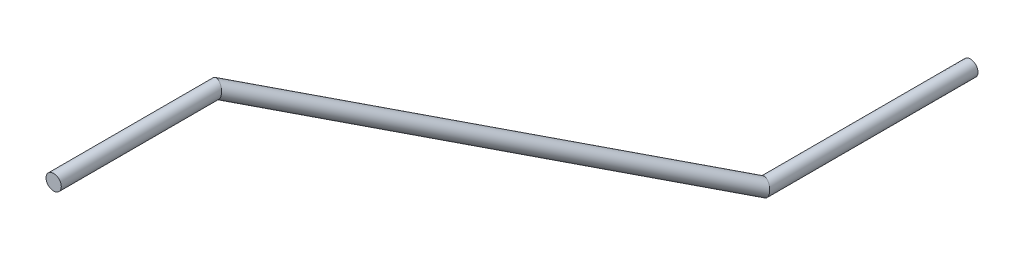
ISO-10303-21;
HEADER;
FILE_DESCRIPTION(('STEP AP214'),'2;1');
FILE_NAME('part.step','',(''),(''),'','','');
FILE_SCHEMA(('AUTOMOTIVE_DESIGN { 1 0 10303 214 1 1 1 1 }'));
ENDSEC;
DATA;
#1=APPLICATION_CONTEXT('core data for automotive mechanical design processes');
#2=APPLICATION_PROTOCOL_DEFINITION('international standard','automotive_design',2000,#1);
#3=PRODUCT_CONTEXT('',#1,'mechanical');
#4=PRODUCT('Part','Part','',(#3));
#5=PRODUCT_RELATED_PRODUCT_CATEGORY('part','',(#4));
#6=PRODUCT_DEFINITION_FORMATION('','',#4);
#7=PRODUCT_DEFINITION_CONTEXT('part definition',#1,'design');
#8=PRODUCT_DEFINITION('design','',#6,#7);
#9=PRODUCT_DEFINITION_SHAPE('','',#8);
#10=(LENGTH_UNIT() NAMED_UNIT(*) SI_UNIT(.MILLI.,.METRE.));
#11=(NAMED_UNIT(*) PLANE_ANGLE_UNIT() SI_UNIT($,.RADIAN.));
#12=(NAMED_UNIT(*) SI_UNIT($,.STERADIAN.) SOLID_ANGLE_UNIT());
#13=UNCERTAINTY_MEASURE_WITH_UNIT(LENGTH_MEASURE(1.E-05),#10,'distance_accuracy_value','');
#14=(GEOMETRIC_REPRESENTATION_CONTEXT(3) GLOBAL_UNCERTAINTY_ASSIGNED_CONTEXT((#13)) GLOBAL_UNIT_ASSIGNED_CONTEXT((#10,
#11,#12)) REPRESENTATION_CONTEXT('',''));
#15=CARTESIAN_POINT('',(0.,0.,0.));
#16=DIRECTION('',(0.,0.,1.));
#17=DIRECTION('',(1.,0.,0.));
#18=AXIS2_PLACEMENT_3D('',#15,#16,#17);
#19=CARTESIAN_POINT('',(-2.08754911818577,-14.8540276921501,38.7099336884413));
#20=DIRECTION('',(0.,0.,-1.));
#21=DIRECTION('',(-1.,0.,0.));
#22=AXIS2_PLACEMENT_3D('',#19,#20,#21);
#23=PLANE('',#22);
#24=CARTESIAN_POINT('',(-2.08754911818577,-14.8540276921501,38.7099336884413));
#25=DIRECTION('',(0.,0.,-1.));
#26=DIRECTION('',(-1.,0.,0.));
#27=AXIS2_PLACEMENT_3D('',#24,#25,#26);
#28=CIRCLE('',#27,0.6);
#29=CARTESIAN_POINT('',(-2.68754911818577,-14.8540276921501,38.7099336884413));
#30=VERTEX_POINT('',#29);
#31=EDGE_CURVE('E46',#30,#30,#28,.T.);
#32=ORIENTED_EDGE('',*,*,#31,.F.);
#33=EDGE_LOOP('',(#32));
#34=FACE_BOUND('',#33,.T.);
#35=ADVANCED_FACE('F43',(#34),#23,.F.);
#36=CARTESIAN_POINT('',(15.,-25.9807621135332,-16.2));
#37=DIRECTION('',(0.,0.,-1.));
#38=DIRECTION('',(-1.,0.,0.));
#39=AXIS2_PLACEMENT_3D('',#36,#37,#38);
#40=PLANE('',#39);
#41=CARTESIAN_POINT('',(15.,-25.9807621135332,-16.2));
#42=DIRECTION('',(0.,0.,-1.));
#43=DIRECTION('',(-1.,0.,0.));
#44=AXIS2_PLACEMENT_3D('',#41,#42,#43);
#45=CIRCLE('',#44,0.6);
#46=CARTESIAN_POINT('',(14.4,-25.9807621135332,-16.2));
#47=VERTEX_POINT('',#46);
#48=EDGE_CURVE('E49',#47,#47,#45,.T.);
#49=ORIENTED_EDGE('',*,*,#48,.T.);
#50=EDGE_LOOP('',(#49));
#51=FACE_BOUND('',#50,.T.);
#52=ADVANCED_FACE('F66',(#51),#40,.T.);
#53=CARTESIAN_POINT('',(-2.08754911818577,-14.8540276921501,25.4196286147672));
#54=DIRECTION('',(0.,0.,1.));
#55=DIRECTION('',(1.,0.,0.));
#56=AXIS2_PLACEMENT_3D('',#53,#54,#55);
#57=CYLINDRICAL_SURFACE('',#56,0.6);
#58=CARTESIAN_POINT('',(-2.08754911818577,-14.8540276921501,25.9599336884413));
#59=DIRECTION('',(-0.273854229254753,0.178323015080451,0.945095108130342));
#60=DIRECTION('',(-0.791988775302238,0.515711686126234,-0.326795404784243));
#61=AXIS2_PLACEMENT_3D('',#58,#59,#60);
#62=ELLIPSE('',#61,0.634856740700907,0.6);
#63=CARTESIAN_POINT('',(-2.59034853074585,-14.5266246519546,25.7524654228839));
#64=VERTEX_POINT('',#63);
#65=EDGE_CURVE('E54',#64,#64,#62,.T.);
#66=ORIENTED_EDGE('',*,*,#65,.T.);
#67=EDGE_LOOP('',(#66));
#68=FACE_BOUND('',#67,.T.);
#69=ORIENTED_EDGE('',*,*,#31,.T.);
#70=EDGE_LOOP('',(#69));
#71=FACE_BOUND('',#70,.T.);
#72=ADVANCED_FACE('F64',(#68,#71),#57,.T.);
#73=CARTESIAN_POINT('',(15.279681673097,-26.1628797289708,-0.424901057328522));
#74=DIRECTION('',(-0.517636584818944,0.337064418439175,0.786409526823805));
#75=DIRECTION('',(0.835289333380713,0.,0.549810630617855));
#76=AXIS2_PLACEMENT_3D('',#73,#74,#75);
#77=CYLINDRICAL_SURFACE('',#76,0.6);
#78=CARTESIAN_POINT('',(15.,-25.9807621135332,0.));
#79=DIRECTION('',(-0.273854229254753,0.178323015080451,0.945095108130342));
#80=DIRECTION('',(0.791988775302238,-0.515711686126234,0.326795404784243));
#81=AXIS2_PLACEMENT_3D('',#78,#79,#80);
#82=ELLIPSE('',#81,0.634856740700907,0.6);
#83=CARTESIAN_POINT('',(15.5027994125601,-26.3081651537286,0.207468265557358));
#84=VERTEX_POINT('',#83);
#85=EDGE_CURVE('E11',#84,#84,#82,.T.);
#86=ORIENTED_EDGE('',*,*,#85,.T.);
#87=EDGE_LOOP('',(#86));
#88=FACE_BOUND('',#87,.T.);
#89=ORIENTED_EDGE('',*,*,#65,.F.);
#90=EDGE_LOOP('',(#89));
#91=FACE_BOUND('',#90,.T.);
#92=ADVANCED_FACE('F73',(#88,#91),#77,.T.);
#93=CARTESIAN_POINT('',(15.,-25.9807621135332,-16.2));
#94=DIRECTION('',(0.,0.,1.));
#95=DIRECTION('',(1.,0.,0.));
#96=AXIS2_PLACEMENT_3D('',#93,#94,#95);
#97=CYLINDRICAL_SURFACE('',#96,0.6);
#98=ORIENTED_EDGE('',*,*,#48,.F.);
#99=EDGE_LOOP('',(#98));
#100=FACE_BOUND('',#99,.T.);
#101=ORIENTED_EDGE('',*,*,#85,.F.);
#102=EDGE_LOOP('',(#101));
#103=FACE_BOUND('',#102,.T.);
#104=ADVANCED_FACE('F72',(#100,#103),#97,.T.);
#105=CLOSED_SHELL('',(#35,#52,#72,#92,#104));
#106=MANIFOLD_SOLID_BREP('B2',#105);
#107=ADVANCED_BREP_SHAPE_REPRESENTATION('',(#18,#106),#14);
#108=SHAPE_DEFINITION_REPRESENTATION(#9,#107);
ENDSEC;
END-ISO-10303-21;
